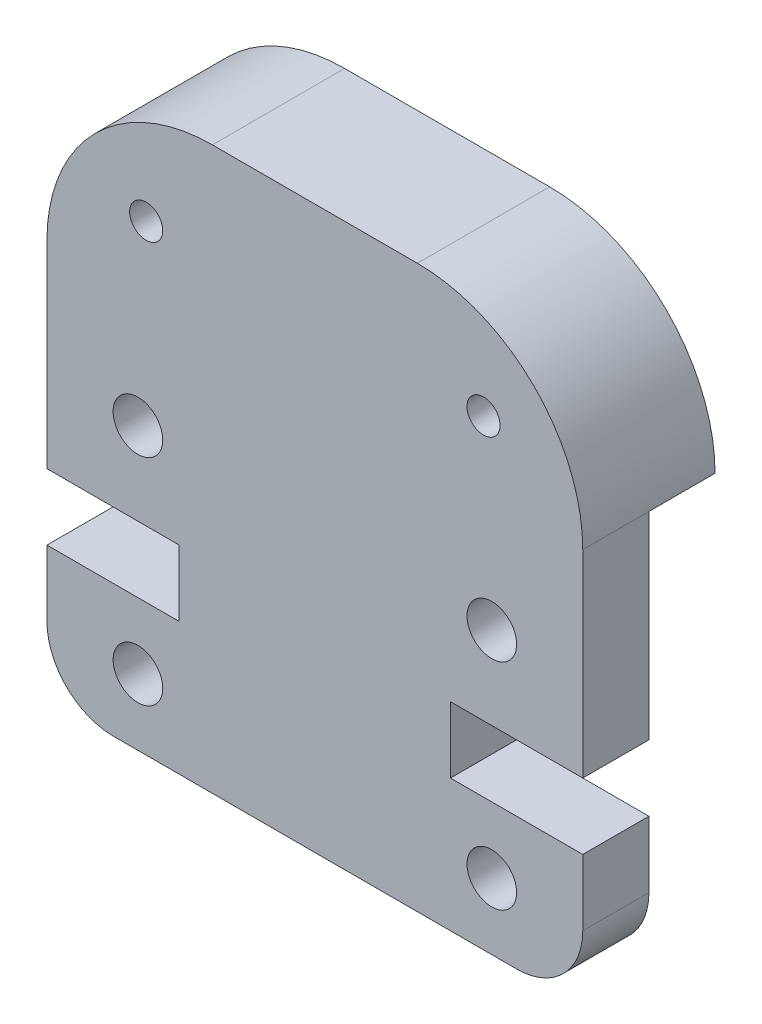
ISO-10303-21;
HEADER;
FILE_DESCRIPTION(('STEP AP214'),'2;1');
FILE_NAME('part.step','',(''),(''),'','','');
FILE_SCHEMA(('AUTOMOTIVE_DESIGN { 1 0 10303 214 1 1 1 1 }'));
ENDSEC;
DATA;
#1=APPLICATION_CONTEXT('core data for automotive mechanical design processes');
#2=APPLICATION_PROTOCOL_DEFINITION('international standard','automotive_design',2000,#1);
#3=PRODUCT_CONTEXT('',#1,'mechanical');
#4=PRODUCT('Part','Part','',(#3));
#5=PRODUCT_RELATED_PRODUCT_CATEGORY('part','',(#4));
#6=PRODUCT_DEFINITION_FORMATION('','',#4);
#7=PRODUCT_DEFINITION_CONTEXT('part definition',#1,'design');
#8=PRODUCT_DEFINITION('design','',#6,#7);
#9=PRODUCT_DEFINITION_SHAPE('','',#8);
#10=(LENGTH_UNIT() NAMED_UNIT(*) SI_UNIT(.MILLI.,.METRE.));
#11=(NAMED_UNIT(*) PLANE_ANGLE_UNIT() SI_UNIT($,.RADIAN.));
#12=(NAMED_UNIT(*) SI_UNIT($,.STERADIAN.) SOLID_ANGLE_UNIT());
#13=UNCERTAINTY_MEASURE_WITH_UNIT(LENGTH_MEASURE(1.E-05),#10,'distance_accuracy_value','');
#14=(GEOMETRIC_REPRESENTATION_CONTEXT(3) GLOBAL_UNCERTAINTY_ASSIGNED_CONTEXT((#13)) GLOBAL_UNIT_ASSIGNED_CONTEXT((#10,
#11,#12)) REPRESENTATION_CONTEXT('',''));
#15=CARTESIAN_POINT('',(0.,0.,0.));
#16=DIRECTION('',(0.,0.,1.));
#17=DIRECTION('',(1.,0.,0.));
#18=AXIS2_PLACEMENT_3D('',#15,#16,#17);
#19=CARTESIAN_POINT('',(-3.09999999999862,11.9799999999986,0.));
#20=DIRECTION('',(0.,0.,-1.));
#21=DIRECTION('',(-1.,0.,0.));
#22=AXIS2_PLACEMENT_3D('',#19,#20,#21);
#23=PLANE('',#22);
#24=CARTESIAN_POINT('',(-5.09999999999842,13.9799999999999,0.));
#25=DIRECTION('',(0.,0.,1.));
#26=DIRECTION('',(-1.,0.,0.));
#27=AXIS2_PLACEMENT_3D('',#24,#25,#26);
#28=CIRCLE('',#27,0.500000000000162);
#29=CARTESIAN_POINT('',(-5.59999999999859,13.9799999999999,0.));
#30=VERTEX_POINT('',#29);
#31=EDGE_CURVE('E277',#30,#30,#28,.T.);
#32=ORIENTED_EDGE('',*,*,#31,.T.);
#33=EDGE_LOOP('',(#32));
#34=FACE_BOUND('',#33,.T.);
#35=CARTESIAN_POINT('',(5.09999999999843,13.9799999999999,0.));
#36=DIRECTION('',(0.,0.,1.));
#37=DIRECTION('',(1.,0.,0.));
#38=AXIS2_PLACEMENT_3D('',#35,#36,#37);
#39=CIRCLE('',#38,0.500000000000168);
#40=CARTESIAN_POINT('',(5.59999999999859,13.9799999999999,0.));
#41=VERTEX_POINT('',#40);
#42=EDGE_CURVE('E265',#41,#41,#39,.T.);
#43=ORIENTED_EDGE('',*,*,#42,.T.);
#44=EDGE_LOOP('',(#43));
#45=FACE_BOUND('',#44,.T.);
#46=CARTESIAN_POINT('',(3.09999999999862,11.9799999999986,0.));
#47=DIRECTION('',(0.,0.,1.));
#48=DIRECTION('',(1.,0.,0.));
#49=AXIS2_PLACEMENT_3D('',#46,#47,#48);
#50=CIRCLE('',#49,5.00000000000135);
#51=CARTESIAN_POINT('',(8.09999999999997,11.9799999999986,0.));
#52=VERTEX_POINT('',#51);
#53=CARTESIAN_POINT('',(3.09999999999862,16.98,0.));
#54=VERTEX_POINT('',#53);
#55=EDGE_CURVE('E69',#52,#54,#50,.T.);
#56=ORIENTED_EDGE('',*,*,#55,.F.);
#57=DIRECTION('',(-1.,0.,0.));
#58=VECTOR('',#57,1.);
#59=CARTESIAN_POINT('',(8.09999999999997,11.9799999999986,0.));
#60=LINE('',#59,#58);
#61=CARTESIAN_POINT('',(-8.09999999999997,11.9799999999986,0.));
#62=VERTEX_POINT('',#61);
#63=EDGE_CURVE('E217',#52,#62,#60,.T.);
#64=ORIENTED_EDGE('',*,*,#63,.T.);
#65=CARTESIAN_POINT('',(-3.09999999999862,11.9799999999986,0.));
#66=DIRECTION('',(0.,0.,1.));
#67=DIRECTION('',(-1.,0.,0.));
#68=AXIS2_PLACEMENT_3D('',#65,#66,#67);
#69=CIRCLE('',#68,5.00000000000136);
#70=CARTESIAN_POINT('',(-3.09999999999862,16.98,0.));
#71=VERTEX_POINT('',#70);
#72=EDGE_CURVE('E150',#71,#62,#69,.T.);
#73=ORIENTED_EDGE('',*,*,#72,.F.);
#74=DIRECTION('',(-1.,0.,0.));
#75=VECTOR('',#74,1.);
#76=CARTESIAN_POINT('',(3.09999999999862,16.98,0.));
#77=LINE('',#76,#75);
#78=EDGE_CURVE('E75',#54,#71,#77,.T.);
#79=ORIENTED_EDGE('',*,*,#78,.F.);
#80=EDGE_LOOP('',(#56,#64,#73,#79));
#81=FACE_BOUND('',#80,.T.);
#82=ADVANCED_FACE('F36',(#34,#45,#81),#23,.T.);
#83=CARTESIAN_POINT('',(-3.09999999999862,11.9799999999986,4.));
#84=DIRECTION('',(0.,0.,-1.));
#85=DIRECTION('',(-1.,0.,0.));
#86=AXIS2_PLACEMENT_3D('',#83,#84,#85);
#87=PLANE('',#86);
#88=CARTESIAN_POINT('',(5.09999999999843,13.9799999999999,4.));
#89=DIRECTION('',(0.,0.,1.));
#90=DIRECTION('',(1.,0.,0.));
#91=AXIS2_PLACEMENT_3D('',#88,#89,#90);
#92=CIRCLE('',#91,0.500000000000168);
#93=CARTESIAN_POINT('',(5.59999999999859,13.9799999999999,4.));
#94=VERTEX_POINT('',#93);
#95=EDGE_CURVE('E266',#94,#94,#92,.T.);
#96=ORIENTED_EDGE('',*,*,#95,.F.);
#97=EDGE_LOOP('',(#96));
#98=FACE_BOUND('',#97,.T.);
#99=CARTESIAN_POINT('',(-5.34999999999997,8.50000000000221,4.));
#100=DIRECTION('',(0.,0.,1.));
#101=DIRECTION('',(-1.,0.,0.));
#102=AXIS2_PLACEMENT_3D('',#99,#100,#101);
#103=CIRCLE('',#102,0.750000000000001);
#104=CARTESIAN_POINT('',(-6.09999999999998,8.50000000000221,4.));
#105=VERTEX_POINT('',#104);
#106=EDGE_CURVE('E274',#105,#105,#103,.T.);
#107=ORIENTED_EDGE('',*,*,#106,.F.);
#108=EDGE_LOOP('',(#107));
#109=FACE_BOUND('',#108,.T.);
#110=CARTESIAN_POINT('',(-5.34999999999999,1.99999999999997,4.));
#111=DIRECTION('',(0.,0.,1.));
#112=DIRECTION('',(-1.,0.,0.));
#113=AXIS2_PLACEMENT_3D('',#110,#111,#112);
#114=CIRCLE('',#113,0.750000000000001);
#115=CARTESIAN_POINT('',(-6.1,1.99999999999997,4.));
#116=VERTEX_POINT('',#115);
#117=EDGE_CURVE('E153',#116,#116,#114,.T.);
#118=ORIENTED_EDGE('',*,*,#117,.F.);
#119=EDGE_LOOP('',(#118));
#120=FACE_BOUND('',#119,.T.);
#121=CARTESIAN_POINT('',(-3.09999999999862,11.9799999999986,4.));
#122=DIRECTION('',(0.,0.,1.));
#123=DIRECTION('',(-1.,0.,0.));
#124=AXIS2_PLACEMENT_3D('',#121,#122,#123);
#125=CIRCLE('',#124,5.00000000000136);
#126=CARTESIAN_POINT('',(-3.09999999999862,16.98,4.));
#127=VERTEX_POINT('',#126);
#128=CARTESIAN_POINT('',(-8.09999999999997,11.9799999999986,4.));
#129=VERTEX_POINT('',#128);
#130=EDGE_CURVE('E156',#127,#129,#125,.T.);
#131=ORIENTED_EDGE('',*,*,#130,.T.);
#132=DIRECTION('',(0.,-1.,0.));
#133=VECTOR('',#132,1.);
#134=CARTESIAN_POINT('',(-8.09999999999997,11.9799999999986,4.));
#135=LINE('',#134,#133);
#136=CARTESIAN_POINT('',(-8.09999999999997,5.99999999999993,4.));
#137=VERTEX_POINT('',#136);
#138=EDGE_CURVE('E83',#129,#137,#135,.T.);
#139=ORIENTED_EDGE('',*,*,#138,.T.);
#140=DIRECTION('',(1.,0.,0.));
#141=VECTOR('',#140,1.);
#142=CARTESIAN_POINT('',(-8.09999999999997,5.99999999999993,4.));
#143=LINE('',#142,#141);
#144=CARTESIAN_POINT('',(-4.10000000000002,5.99999999999993,4.));
#145=VERTEX_POINT('',#144);
#146=EDGE_CURVE('E199',#137,#145,#143,.T.);
#147=ORIENTED_EDGE('',*,*,#146,.T.);
#148=DIRECTION('',(0.,-1.,0.));
#149=VECTOR('',#148,1.);
#150=CARTESIAN_POINT('',(-4.10000000000002,5.99999999999993,4.));
#151=LINE('',#150,#149);
#152=CARTESIAN_POINT('',(-4.10000000000002,3.99999999999995,4.));
#153=VERTEX_POINT('',#152);
#154=EDGE_CURVE('E288',#145,#153,#151,.T.);
#155=ORIENTED_EDGE('',*,*,#154,.T.);
#156=DIRECTION('',(-1.,0.,0.));
#157=VECTOR('',#156,1.);
#158=CARTESIAN_POINT('',(-4.10000000000002,3.99999999999995,4.));
#159=LINE('',#158,#157);
#160=CARTESIAN_POINT('',(-8.09999999999997,3.99999999999995,4.));
#161=VERTEX_POINT('',#160);
#162=EDGE_CURVE('E290',#153,#161,#159,.T.);
#163=ORIENTED_EDGE('',*,*,#162,.T.);
#164=DIRECTION('',(0.,-1.,0.));
#165=VECTOR('',#164,1.);
#166=CARTESIAN_POINT('',(-8.09999999999997,1.99999999999997,4.));
#167=LINE('',#166,#165);
#168=CARTESIAN_POINT('',(-8.09999999999997,1.99999999999997,4.));
#169=VERTEX_POINT('',#168);
#170=EDGE_CURVE('E292',#161,#169,#167,.T.);
#171=ORIENTED_EDGE('',*,*,#170,.T.);
#172=CARTESIAN_POINT('',(-6.1,1.99999999999997,4.));
#173=DIRECTION('',(0.,0.,1.));
#174=DIRECTION('',(-1.,0.,0.));
#175=AXIS2_PLACEMENT_3D('',#172,#173,#174);
#176=CIRCLE('',#175,1.99999999999998);
#177=CARTESIAN_POINT('',(-6.09999999999999,0.,4.));
#178=VERTEX_POINT('',#177);
#179=EDGE_CURVE('E294',#169,#178,#176,.T.);
#180=ORIENTED_EDGE('',*,*,#179,.T.);
#181=DIRECTION('',(1.,0.,0.));
#182=VECTOR('',#181,1.);
#183=CARTESIAN_POINT('',(6.1,0.,4.));
#184=LINE('',#183,#182);
#185=CARTESIAN_POINT('',(6.1,0.,4.));
#186=VERTEX_POINT('',#185);
#187=EDGE_CURVE('E296',#178,#186,#184,.T.);
#188=ORIENTED_EDGE('',*,*,#187,.T.);
#189=CARTESIAN_POINT('',(6.1,1.99999999999998,4.));
#190=DIRECTION('',(0.,0.,1.));
#191=DIRECTION('',(1.,0.,0.));
#192=AXIS2_PLACEMENT_3D('',#189,#190,#191);
#193=CIRCLE('',#192,1.99999999999998);
#194=CARTESIAN_POINT('',(8.09999999999997,1.99999999999998,4.));
#195=VERTEX_POINT('',#194);
#196=EDGE_CURVE('E298',#186,#195,#193,.T.);
#197=ORIENTED_EDGE('',*,*,#196,.T.);
#198=DIRECTION('',(0.,1.,0.));
#199=VECTOR('',#198,1.);
#200=CARTESIAN_POINT('',(8.09999999999997,1.99999999999998,4.));
#201=LINE('',#200,#199);
#202=CARTESIAN_POINT('',(8.09999999999997,3.99999999999995,4.));
#203=VERTEX_POINT('',#202);
#204=EDGE_CURVE('E300',#195,#203,#201,.T.);
#205=ORIENTED_EDGE('',*,*,#204,.T.);
#206=DIRECTION('',(-1.,0.,0.));
#207=VECTOR('',#206,1.);
#208=CARTESIAN_POINT('',(4.10000000000002,3.99999999999995,4.));
#209=LINE('',#208,#207);
#210=CARTESIAN_POINT('',(4.10000000000002,3.99999999999995,4.));
#211=VERTEX_POINT('',#210);
#212=EDGE_CURVE('E302',#203,#211,#209,.T.);
#213=ORIENTED_EDGE('',*,*,#212,.T.);
#214=DIRECTION('',(0.,1.,0.));
#215=VECTOR('',#214,1.);
#216=CARTESIAN_POINT('',(4.10000000000002,5.99999999999993,4.));
#217=LINE('',#216,#215);
#218=CARTESIAN_POINT('',(4.10000000000002,5.99999999999993,4.));
#219=VERTEX_POINT('',#218);
#220=EDGE_CURVE('E304',#211,#219,#217,.T.);
#221=ORIENTED_EDGE('',*,*,#220,.T.);
#222=DIRECTION('',(1.,0.,0.));
#223=VECTOR('',#222,1.);
#224=CARTESIAN_POINT('',(8.09999999999997,5.99999999999993,4.));
#225=LINE('',#224,#223);
#226=CARTESIAN_POINT('',(8.09999999999997,5.99999999999993,4.));
#227=VERTEX_POINT('',#226);
#228=EDGE_CURVE('E129',#219,#227,#225,.T.);
#229=ORIENTED_EDGE('',*,*,#228,.T.);
#230=DIRECTION('',(0.,1.,0.));
#231=VECTOR('',#230,1.);
#232=CARTESIAN_POINT('',(8.09999999999997,11.9799999999986,4.));
#233=LINE('',#232,#231);
#234=CARTESIAN_POINT('',(8.09999999999997,11.9799999999986,4.));
#235=VERTEX_POINT('',#234);
#236=EDGE_CURVE('E122',#227,#235,#233,.T.);
#237=ORIENTED_EDGE('',*,*,#236,.T.);
#238=CARTESIAN_POINT('',(3.09999999999862,11.9799999999986,4.));
#239=DIRECTION('',(0.,0.,1.));
#240=DIRECTION('',(1.,0.,0.));
#241=AXIS2_PLACEMENT_3D('',#238,#239,#240);
#242=CIRCLE('',#241,5.00000000000135);
#243=CARTESIAN_POINT('',(3.09999999999862,16.98,4.));
#244=VERTEX_POINT('',#243);
#245=EDGE_CURVE('E127',#235,#244,#242,.T.);
#246=ORIENTED_EDGE('',*,*,#245,.T.);
#247=DIRECTION('',(-1.,0.,0.));
#248=VECTOR('',#247,1.);
#249=CARTESIAN_POINT('',(3.09999999999862,16.98,4.));
#250=LINE('',#249,#248);
#251=EDGE_CURVE('E54',#244,#127,#250,.T.);
#252=ORIENTED_EDGE('',*,*,#251,.T.);
#253=EDGE_LOOP('',(#131,#139,#147,#155,#163,#171,#180,#188,#197,#205,#213,#221,#229,#237,#246,#252));
#254=FACE_BOUND('',#253,.T.);
#255=CARTESIAN_POINT('',(-5.09999999999842,13.9799999999999,4.));
#256=DIRECTION('',(0.,0.,1.));
#257=DIRECTION('',(-1.,0.,0.));
#258=AXIS2_PLACEMENT_3D('',#255,#256,#257);
#259=CIRCLE('',#258,0.500000000000162);
#260=CARTESIAN_POINT('',(-5.59999999999859,13.9799999999999,4.));
#261=VERTEX_POINT('',#260);
#262=EDGE_CURVE('E278',#261,#261,#259,.T.);
#263=ORIENTED_EDGE('',*,*,#262,.F.);
#264=EDGE_LOOP('',(#263));
#265=FACE_BOUND('',#264,.T.);
#266=CARTESIAN_POINT('',(5.34999999999998,8.50000000000221,4.));
#267=DIRECTION('',(0.,0.,1.));
#268=DIRECTION('',(1.,0.,0.));
#269=AXIS2_PLACEMENT_3D('',#266,#267,#268);
#270=CIRCLE('',#269,0.750000000000001);
#271=CARTESIAN_POINT('',(6.09999999999998,8.50000000000221,4.));
#272=VERTEX_POINT('',#271);
#273=EDGE_CURVE('E269',#272,#272,#270,.T.);
#274=ORIENTED_EDGE('',*,*,#273,.F.);
#275=EDGE_LOOP('',(#274));
#276=FACE_BOUND('',#275,.T.);
#277=CARTESIAN_POINT('',(5.35,1.99999999999998,4.));
#278=DIRECTION('',(0.,0.,1.));
#279=DIRECTION('',(1.,0.,0.));
#280=AXIS2_PLACEMENT_3D('',#277,#278,#279);
#281=CIRCLE('',#280,0.750000000000001);
#282=CARTESIAN_POINT('',(6.1,1.99999999999998,4.));
#283=VERTEX_POINT('',#282);
#284=EDGE_CURVE('E262',#283,#283,#281,.T.);
#285=ORIENTED_EDGE('',*,*,#284,.F.);
#286=EDGE_LOOP('',(#285));
#287=FACE_BOUND('',#286,.T.);
#288=ADVANCED_FACE('F124',(#98,#109,#120,#254,#265,#276,#287),#87,.F.);
#289=CARTESIAN_POINT('',(-3.09999999999862,11.9799999999986,4.));
#290=DIRECTION('',(0.,0.,-1.));
#291=DIRECTION('',(-1.,0.,0.));
#292=AXIS2_PLACEMENT_3D('',#289,#290,#291);
#293=CYLINDRICAL_SURFACE('',#292,5.00000000000136);
#294=ORIENTED_EDGE('',*,*,#72,.T.);
#295=DIRECTION('',(0.,0.,-1.));
#296=VECTOR('',#295,1.);
#297=CARTESIAN_POINT('',(-8.09999999999997,11.9799999999986,2.));
#298=LINE('',#297,#296);
#299=CARTESIAN_POINT('',(-8.09999999999997,11.9799999999986,2.));
#300=VERTEX_POINT('',#299);
#301=EDGE_CURVE('E224',#300,#62,#298,.T.);
#302=ORIENTED_EDGE('',*,*,#301,.F.);
#303=DIRECTION('',(0.,0.,-1.));
#304=VECTOR('',#303,1.);
#305=CARTESIAN_POINT('',(-8.09999999999997,11.9799999999986,4.));
#306=LINE('',#305,#304);
#307=EDGE_CURVE('E11',#129,#300,#306,.T.);
#308=ORIENTED_EDGE('',*,*,#307,.F.);
#309=ORIENTED_EDGE('',*,*,#130,.F.);
#310=DIRECTION('',(0.,0.,-1.));
#311=VECTOR('',#310,1.);
#312=CARTESIAN_POINT('',(-3.09999999999862,16.98,4.));
#313=LINE('',#312,#311);
#314=EDGE_CURVE('E146',#127,#71,#313,.T.);
#315=ORIENTED_EDGE('',*,*,#314,.T.);
#316=EDGE_LOOP('',(#294,#302,#308,#309,#315));
#317=FACE_BOUND('',#316,.T.);
#318=ADVANCED_FACE('F38',(#317),#293,.T.);
#319=CARTESIAN_POINT('',(-8.09999999999997,11.9799999999986,4.));
#320=DIRECTION('',(1.,0.,0.));
#321=DIRECTION('',(0.,1.,0.));
#322=AXIS2_PLACEMENT_3D('',#319,#320,#321);
#323=PLANE('',#322);
#324=ORIENTED_EDGE('',*,*,#307,.T.);
#325=DIRECTION('',(0.,-1.,0.));
#326=VECTOR('',#325,1.);
#327=CARTESIAN_POINT('',(-8.09999999999997,11.9799999999986,2.));
#328=LINE('',#327,#326);
#329=CARTESIAN_POINT('',(-8.09999999999997,5.99999999999993,2.));
#330=VERTEX_POINT('',#329);
#331=EDGE_CURVE('E206',#300,#330,#328,.T.);
#332=ORIENTED_EDGE('',*,*,#331,.T.);
#333=DIRECTION('',(0.,0.,-1.));
#334=VECTOR('',#333,1.);
#335=CARTESIAN_POINT('',(-8.09999999999997,5.99999999999993,4.));
#336=LINE('',#335,#334);
#337=EDGE_CURVE('E46',#137,#330,#336,.T.);
#338=ORIENTED_EDGE('',*,*,#337,.F.);
#339=ORIENTED_EDGE('',*,*,#138,.F.);
#340=EDGE_LOOP('',(#324,#332,#338,#339));
#341=FACE_BOUND('',#340,.T.);
#342=ADVANCED_FACE('F204',(#341),#323,.F.);
#343=CARTESIAN_POINT('',(-8.09999999999997,5.99999999999993,4.));
#344=DIRECTION('',(0.,1.,0.));
#345=DIRECTION('',(-1.,0.,0.));
#346=AXIS2_PLACEMENT_3D('',#343,#344,#345);
#347=PLANE('',#346);
#348=ORIENTED_EDGE('',*,*,#337,.T.);
#349=DIRECTION('',(1.,0.,0.));
#350=VECTOR('',#349,1.);
#351=CARTESIAN_POINT('',(-8.09999999999997,5.99999999999993,2.));
#352=LINE('',#351,#350);
#353=CARTESIAN_POINT('',(-4.10000000000002,5.99999999999993,2.));
#354=VERTEX_POINT('',#353);
#355=EDGE_CURVE('E198',#330,#354,#352,.T.);
#356=ORIENTED_EDGE('',*,*,#355,.T.);
#357=DIRECTION('',(0.,0.,-1.));
#358=VECTOR('',#357,1.);
#359=CARTESIAN_POINT('',(-4.10000000000002,5.99999999999993,4.));
#360=LINE('',#359,#358);
#361=EDGE_CURVE('E187',#145,#354,#360,.T.);
#362=ORIENTED_EDGE('',*,*,#361,.F.);
#363=ORIENTED_EDGE('',*,*,#146,.F.);
#364=EDGE_LOOP('',(#348,#356,#362,#363));
#365=FACE_BOUND('',#364,.T.);
#366=ADVANCED_FACE('F195',(#365),#347,.F.);
#367=CARTESIAN_POINT('',(-4.10000000000002,5.99999999999993,4.));
#368=DIRECTION('',(1.,0.,0.));
#369=DIRECTION('',(0.,0.,-1.));
#370=AXIS2_PLACEMENT_3D('',#367,#368,#369);
#371=PLANE('',#370);
#372=ORIENTED_EDGE('',*,*,#361,.T.);
#373=DIRECTION('',(0.,-1.,0.));
#374=VECTOR('',#373,1.);
#375=CARTESIAN_POINT('',(-4.10000000000002,5.99999999999993,2.));
#376=LINE('',#375,#374);
#377=CARTESIAN_POINT('',(-4.10000000000002,3.99999999999995,2.));
#378=VERTEX_POINT('',#377);
#379=EDGE_CURVE('E258',#354,#378,#376,.T.);
#380=ORIENTED_EDGE('',*,*,#379,.T.);
#381=DIRECTION('',(0.,0.,-1.));
#382=VECTOR('',#381,1.);
#383=CARTESIAN_POINT('',(-4.10000000000002,3.99999999999995,4.));
#384=LINE('',#383,#382);
#385=EDGE_CURVE('E184',#153,#378,#384,.T.);
#386=ORIENTED_EDGE('',*,*,#385,.F.);
#387=ORIENTED_EDGE('',*,*,#154,.F.);
#388=EDGE_LOOP('',(#372,#380,#386,#387));
#389=FACE_BOUND('',#388,.T.);
#390=ADVANCED_FACE('F333',(#389),#371,.F.);
#391=CARTESIAN_POINT('',(-4.10000000000002,3.99999999999995,4.));
#392=DIRECTION('',(0.,-1.,0.));
#393=DIRECTION('',(1.,0.,0.));
#394=AXIS2_PLACEMENT_3D('',#391,#392,#393);
#395=PLANE('',#394);
#396=ORIENTED_EDGE('',*,*,#385,.T.);
#397=DIRECTION('',(-1.,0.,0.));
#398=VECTOR('',#397,1.);
#399=CARTESIAN_POINT('',(-4.10000000000002,3.99999999999995,2.));
#400=LINE('',#399,#398);
#401=CARTESIAN_POINT('',(-8.09999999999997,3.99999999999995,2.));
#402=VERTEX_POINT('',#401);
#403=EDGE_CURVE('E255',#378,#402,#400,.T.);
#404=ORIENTED_EDGE('',*,*,#403,.T.);
#405=DIRECTION('',(0.,0.,-1.));
#406=VECTOR('',#405,1.);
#407=CARTESIAN_POINT('',(-8.09999999999997,3.99999999999995,4.));
#408=LINE('',#407,#406);
#409=EDGE_CURVE('E181',#161,#402,#408,.T.);
#410=ORIENTED_EDGE('',*,*,#409,.F.);
#411=ORIENTED_EDGE('',*,*,#162,.F.);
#412=EDGE_LOOP('',(#396,#404,#410,#411));
#413=FACE_BOUND('',#412,.T.);
#414=ADVANCED_FACE('F337',(#413),#395,.F.);
#415=CARTESIAN_POINT('',(-8.09999999999997,1.99999999999997,4.));
#416=DIRECTION('',(1.,0.,0.));
#417=DIRECTION('',(0.,0.,-1.));
#418=AXIS2_PLACEMENT_3D('',#415,#416,#417);
#419=PLANE('',#418);
#420=ORIENTED_EDGE('',*,*,#409,.T.);
#421=CARTESIAN_POINT('',(-8.09999999999997,1.99999999999997,2.));
#422=VERTEX_POINT('',#421);
#423=EDGE_CURVE('E212',#402,#422,#328,.T.);
#424=ORIENTED_EDGE('',*,*,#423,.T.);
#425=DIRECTION('',(0.,0.,-1.));
#426=VECTOR('',#425,1.);
#427=CARTESIAN_POINT('',(-8.09999999999997,1.99999999999997,4.));
#428=LINE('',#427,#426);
#429=EDGE_CURVE('E178',#169,#422,#428,.T.);
#430=ORIENTED_EDGE('',*,*,#429,.F.);
#431=ORIENTED_EDGE('',*,*,#170,.F.);
#432=EDGE_LOOP('',(#420,#424,#430,#431));
#433=FACE_BOUND('',#432,.T.);
#434=ADVANCED_FACE('F393',(#433),#419,.F.);
#435=CARTESIAN_POINT('',(-6.1,1.99999999999997,4.));
#436=DIRECTION('',(0.,0.,-1.));
#437=DIRECTION('',(-1.,0.,0.));
#438=AXIS2_PLACEMENT_3D('',#435,#436,#437);
#439=CYLINDRICAL_SURFACE('',#438,1.99999999999998);
#440=ORIENTED_EDGE('',*,*,#429,.T.);
#441=CARTESIAN_POINT('',(-6.1,1.99999999999997,2.));
#442=DIRECTION('',(0.,0.,1.));
#443=DIRECTION('',(1.,0.,0.));
#444=AXIS2_PLACEMENT_3D('',#441,#442,#443);
#445=CIRCLE('',#444,1.99999999999998);
#446=CARTESIAN_POINT('',(-6.09999999999999,0.,2.));
#447=VERTEX_POINT('',#446);
#448=EDGE_CURVE('E252',#422,#447,#445,.T.);
#449=ORIENTED_EDGE('',*,*,#448,.T.);
#450=DIRECTION('',(0.,0.,-1.));
#451=VECTOR('',#450,1.);
#452=CARTESIAN_POINT('',(-6.09999999999999,0.,4.));
#453=LINE('',#452,#451);
#454=EDGE_CURVE('E175',#178,#447,#453,.T.);
#455=ORIENTED_EDGE('',*,*,#454,.F.);
#456=ORIENTED_EDGE('',*,*,#179,.F.);
#457=EDGE_LOOP('',(#440,#449,#455,#456));
#458=FACE_BOUND('',#457,.T.);
#459=ADVANCED_FACE('F389',(#458),#439,.T.);
#460=CARTESIAN_POINT('',(6.1,0.,4.));
#461=DIRECTION('',(0.,1.,0.));
#462=DIRECTION('',(-1.,0.,0.));
#463=AXIS2_PLACEMENT_3D('',#460,#461,#462);
#464=PLANE('',#463);
#465=ORIENTED_EDGE('',*,*,#454,.T.);
#466=DIRECTION('',(1.,0.,0.));
#467=VECTOR('',#466,1.);
#468=CARTESIAN_POINT('',(-8.09999999999997,0.,2.));
#469=LINE('',#468,#467);
#470=CARTESIAN_POINT('',(6.1,0.,2.));
#471=VERTEX_POINT('',#470);
#472=EDGE_CURVE('E211',#447,#471,#469,.T.);
#473=ORIENTED_EDGE('',*,*,#472,.T.);
#474=DIRECTION('',(0.,0.,-1.));
#475=VECTOR('',#474,1.);
#476=CARTESIAN_POINT('',(6.1,0.,4.));
#477=LINE('',#476,#475);
#478=EDGE_CURVE('E172',#186,#471,#477,.T.);
#479=ORIENTED_EDGE('',*,*,#478,.F.);
#480=ORIENTED_EDGE('',*,*,#187,.F.);
#481=EDGE_LOOP('',(#465,#473,#479,#480));
#482=FACE_BOUND('',#481,.T.);
#483=ADVANCED_FACE('F385',(#482),#464,.F.);
#484=CARTESIAN_POINT('',(6.1,1.99999999999998,4.));
#485=DIRECTION('',(0.,0.,-1.));
#486=DIRECTION('',(-1.,0.,0.));
#487=AXIS2_PLACEMENT_3D('',#484,#485,#486);
#488=CYLINDRICAL_SURFACE('',#487,1.99999999999998);
#489=ORIENTED_EDGE('',*,*,#478,.T.);
#490=CARTESIAN_POINT('',(6.1,1.99999999999998,2.));
#491=DIRECTION('',(0.,0.,1.));
#492=DIRECTION('',(1.,0.,0.));
#493=AXIS2_PLACEMENT_3D('',#490,#491,#492);
#494=CIRCLE('',#493,1.99999999999998);
#495=CARTESIAN_POINT('',(8.09999999999997,1.99999999999998,2.));
#496=VERTEX_POINT('',#495);
#497=EDGE_CURVE('E249',#471,#496,#494,.T.);
#498=ORIENTED_EDGE('',*,*,#497,.T.);
#499=DIRECTION('',(0.,0.,-1.));
#500=VECTOR('',#499,1.);
#501=CARTESIAN_POINT('',(8.09999999999997,1.99999999999998,4.));
#502=LINE('',#501,#500);
#503=EDGE_CURVE('E169',#195,#496,#502,.T.);
#504=ORIENTED_EDGE('',*,*,#503,.F.);
#505=ORIENTED_EDGE('',*,*,#196,.F.);
#506=EDGE_LOOP('',(#489,#498,#504,#505));
#507=FACE_BOUND('',#506,.T.);
#508=ADVANCED_FACE('F381',(#507),#488,.T.);
#509=CARTESIAN_POINT('',(8.09999999999997,1.99999999999998,4.));
#510=DIRECTION('',(-1.,0.,0.));
#511=DIRECTION('',(0.,0.,1.));
#512=AXIS2_PLACEMENT_3D('',#509,#510,#511);
#513=PLANE('',#512);
#514=ORIENTED_EDGE('',*,*,#503,.T.);
#515=DIRECTION('',(0.,1.,0.));
#516=VECTOR('',#515,1.);
#517=CARTESIAN_POINT('',(8.09999999999997,0.,2.));
#518=LINE('',#517,#516);
#519=CARTESIAN_POINT('',(8.09999999999997,3.99999999999995,2.));
#520=VERTEX_POINT('',#519);
#521=EDGE_CURVE('E220',#496,#520,#518,.T.);
#522=ORIENTED_EDGE('',*,*,#521,.T.);
#523=DIRECTION('',(0.,0.,-1.));
#524=VECTOR('',#523,1.);
#525=CARTESIAN_POINT('',(8.09999999999997,3.99999999999995,4.));
#526=LINE('',#525,#524);
#527=EDGE_CURVE('E166',#203,#520,#526,.T.);
#528=ORIENTED_EDGE('',*,*,#527,.F.);
#529=ORIENTED_EDGE('',*,*,#204,.F.);
#530=EDGE_LOOP('',(#514,#522,#528,#529));
#531=FACE_BOUND('',#530,.T.);
#532=ADVANCED_FACE('F377',(#531),#513,.F.);
#533=CARTESIAN_POINT('',(4.10000000000002,3.99999999999995,4.));
#534=DIRECTION('',(0.,-1.,0.));
#535=DIRECTION('',(0.,0.,-1.));
#536=AXIS2_PLACEMENT_3D('',#533,#534,#535);
#537=PLANE('',#536);
#538=ORIENTED_EDGE('',*,*,#527,.T.);
#539=DIRECTION('',(-1.,0.,0.));
#540=VECTOR('',#539,1.);
#541=CARTESIAN_POINT('',(4.10000000000002,3.99999999999995,2.));
#542=LINE('',#541,#540);
#543=CARTESIAN_POINT('',(4.10000000000002,3.99999999999995,2.));
#544=VERTEX_POINT('',#543);
#545=EDGE_CURVE('E246',#520,#544,#542,.T.);
#546=ORIENTED_EDGE('',*,*,#545,.T.);
#547=DIRECTION('',(0.,0.,-1.));
#548=VECTOR('',#547,1.);
#549=CARTESIAN_POINT('',(4.10000000000002,3.99999999999995,4.));
#550=LINE('',#549,#548);
#551=EDGE_CURVE('E163',#211,#544,#550,.T.);
#552=ORIENTED_EDGE('',*,*,#551,.F.);
#553=ORIENTED_EDGE('',*,*,#212,.F.);
#554=EDGE_LOOP('',(#538,#546,#552,#553));
#555=FACE_BOUND('',#554,.T.);
#556=ADVANCED_FACE('F374',(#555),#537,.F.);
#557=CARTESIAN_POINT('',(4.10000000000002,5.99999999999993,4.));
#558=DIRECTION('',(-1.,0.,0.));
#559=DIRECTION('',(0.,0.,1.));
#560=AXIS2_PLACEMENT_3D('',#557,#558,#559);
#561=PLANE('',#560);
#562=ORIENTED_EDGE('',*,*,#551,.T.);
#563=DIRECTION('',(0.,1.,0.));
#564=VECTOR('',#563,1.);
#565=CARTESIAN_POINT('',(4.10000000000002,5.99999999999993,2.));
#566=LINE('',#565,#564);
#567=CARTESIAN_POINT('',(4.10000000000002,5.99999999999993,2.));
#568=VERTEX_POINT('',#567);
#569=EDGE_CURVE('E243',#544,#568,#566,.T.);
#570=ORIENTED_EDGE('',*,*,#569,.T.);
#571=DIRECTION('',(0.,0.,-1.));
#572=VECTOR('',#571,1.);
#573=CARTESIAN_POINT('',(4.10000000000002,5.99999999999993,4.));
#574=LINE('',#573,#572);
#575=EDGE_CURVE('E160',#219,#568,#574,.T.);
#576=ORIENTED_EDGE('',*,*,#575,.F.);
#577=ORIENTED_EDGE('',*,*,#220,.F.);
#578=EDGE_LOOP('',(#562,#570,#576,#577));
#579=FACE_BOUND('',#578,.T.);
#580=ADVANCED_FACE('F310',(#579),#561,.F.);
#581=CARTESIAN_POINT('',(8.09999999999997,5.99999999999993,4.));
#582=DIRECTION('',(0.,1.,0.));
#583=DIRECTION('',(0.,0.,1.));
#584=AXIS2_PLACEMENT_3D('',#581,#582,#583);
#585=PLANE('',#584);
#586=ORIENTED_EDGE('',*,*,#575,.T.);
#587=DIRECTION('',(1.,0.,0.));
#588=VECTOR('',#587,1.);
#589=CARTESIAN_POINT('',(8.09999999999997,5.99999999999993,2.));
#590=LINE('',#589,#588);
#591=CARTESIAN_POINT('',(8.09999999999997,5.99999999999993,2.));
#592=VERTEX_POINT('',#591);
#593=EDGE_CURVE('E240',#568,#592,#590,.T.);
#594=ORIENTED_EDGE('',*,*,#593,.T.);
#595=DIRECTION('',(0.,0.,-1.));
#596=VECTOR('',#595,1.);
#597=CARTESIAN_POINT('',(8.09999999999997,5.99999999999993,4.));
#598=LINE('',#597,#596);
#599=EDGE_CURVE('E141',#227,#592,#598,.T.);
#600=ORIENTED_EDGE('',*,*,#599,.F.);
#601=ORIENTED_EDGE('',*,*,#228,.F.);
#602=EDGE_LOOP('',(#586,#594,#600,#601));
#603=FACE_BOUND('',#602,.T.);
#604=ADVANCED_FACE('F314',(#603),#585,.F.);
#605=CARTESIAN_POINT('',(8.09999999999997,11.9799999999986,4.));
#606=DIRECTION('',(-1.,0.,0.));
#607=DIRECTION('',(0.,0.,1.));
#608=AXIS2_PLACEMENT_3D('',#605,#606,#607);
#609=PLANE('',#608);
#610=ORIENTED_EDGE('',*,*,#599,.T.);
#611=CARTESIAN_POINT('',(8.09999999999997,11.9799999999986,2.));
#612=VERTEX_POINT('',#611);
#613=EDGE_CURVE('E140',#592,#612,#518,.T.);
#614=ORIENTED_EDGE('',*,*,#613,.T.);
#615=DIRECTION('',(0.,0.,-1.));
#616=VECTOR('',#615,1.);
#617=CARTESIAN_POINT('',(8.09999999999997,11.9799999999986,4.));
#618=LINE('',#617,#616);
#619=EDGE_CURVE('E136',#235,#612,#618,.T.);
#620=ORIENTED_EDGE('',*,*,#619,.F.);
#621=ORIENTED_EDGE('',*,*,#236,.F.);
#622=EDGE_LOOP('',(#610,#614,#620,#621));
#623=FACE_BOUND('',#622,.T.);
#624=ADVANCED_FACE('F137',(#623),#609,.F.);
#625=CARTESIAN_POINT('',(3.09999999999862,11.9799999999986,4.));
#626=DIRECTION('',(0.,0.,-1.));
#627=DIRECTION('',(-1.,0.,0.));
#628=AXIS2_PLACEMENT_3D('',#625,#626,#627);
#629=CYLINDRICAL_SURFACE('',#628,5.00000000000135);
#630=ORIENTED_EDGE('',*,*,#55,.T.);
#631=DIRECTION('',(0.,0.,-1.));
#632=VECTOR('',#631,1.);
#633=CARTESIAN_POINT('',(3.09999999999862,16.98,4.));
#634=LINE('',#633,#632);
#635=EDGE_CURVE('E142',#244,#54,#634,.T.);
#636=ORIENTED_EDGE('',*,*,#635,.F.);
#637=ORIENTED_EDGE('',*,*,#245,.F.);
#638=ORIENTED_EDGE('',*,*,#619,.T.);
#639=DIRECTION('',(0.,0.,-1.));
#640=VECTOR('',#639,1.);
#641=CARTESIAN_POINT('',(8.09999999999997,11.9799999999986,2.));
#642=LINE('',#641,#640);
#643=EDGE_CURVE('E229',#612,#52,#642,.T.);
#644=ORIENTED_EDGE('',*,*,#643,.T.);
#645=EDGE_LOOP('',(#630,#636,#637,#638,#644));
#646=FACE_BOUND('',#645,.T.);
#647=ADVANCED_FACE('F144',(#646),#629,.T.);
#648=CARTESIAN_POINT('',(3.09999999999862,16.98,4.));
#649=DIRECTION('',(0.,-1.,0.));
#650=DIRECTION('',(0.,0.,-1.));
#651=AXIS2_PLACEMENT_3D('',#648,#649,#650);
#652=PLANE('',#651);
#653=ORIENTED_EDGE('',*,*,#78,.T.);
#654=ORIENTED_EDGE('',*,*,#314,.F.);
#655=ORIENTED_EDGE('',*,*,#251,.F.);
#656=ORIENTED_EDGE('',*,*,#635,.T.);
#657=EDGE_LOOP('',(#653,#654,#655,#656));
#658=FACE_BOUND('',#657,.T.);
#659=ADVANCED_FACE('F362',(#658),#652,.F.);
#660=CARTESIAN_POINT('',(-5.34999999999999,1.99999999999997,4.));
#661=DIRECTION('',(0.,0.,-1.));
#662=DIRECTION('',(-1.,0.,0.));
#663=AXIS2_PLACEMENT_3D('',#660,#661,#662);
#664=CYLINDRICAL_SURFACE('',#663,0.750000000000001);
#665=CARTESIAN_POINT('',(-5.34999999999999,1.99999999999997,2.));
#666=DIRECTION('',(0.,0.,1.));
#667=DIRECTION('',(1.,0.,0.));
#668=AXIS2_PLACEMENT_3D('',#665,#666,#667);
#669=CIRCLE('',#668,0.750000000000001);
#670=CARTESIAN_POINT('',(-4.59999999999999,1.99999999999997,2.));
#671=VERTEX_POINT('',#670);
#672=EDGE_CURVE('E237',#671,#671,#669,.T.);
#673=ORIENTED_EDGE('',*,*,#672,.F.);
#674=EDGE_LOOP('',(#673));
#675=FACE_BOUND('',#674,.T.);
#676=ORIENTED_EDGE('',*,*,#117,.T.);
#677=EDGE_LOOP('',(#676));
#678=FACE_BOUND('',#677,.T.);
#679=ADVANCED_FACE('F365',(#675,#678),#664,.F.);
#680=CARTESIAN_POINT('',(-5.09999999999842,13.9799999999999,4.));
#681=DIRECTION('',(0.,0.,-1.));
#682=DIRECTION('',(-1.,0.,0.));
#683=AXIS2_PLACEMENT_3D('',#680,#681,#682);
#684=CYLINDRICAL_SURFACE('',#683,0.500000000000162);
#685=ORIENTED_EDGE('',*,*,#262,.T.);
#686=EDGE_LOOP('',(#685));
#687=FACE_BOUND('',#686,.T.);
#688=ORIENTED_EDGE('',*,*,#31,.F.);
#689=EDGE_LOOP('',(#688));
#690=FACE_BOUND('',#689,.T.);
#691=ADVANCED_FACE('F427',(#687,#690),#684,.F.);
#692=CARTESIAN_POINT('',(-5.34999999999997,8.50000000000221,4.));
#693=DIRECTION('',(0.,0.,-1.));
#694=DIRECTION('',(-1.,0.,0.));
#695=AXIS2_PLACEMENT_3D('',#692,#693,#694);
#696=CYLINDRICAL_SURFACE('',#695,0.750000000000001);
#697=CARTESIAN_POINT('',(-5.34999999999997,8.50000000000221,2.));
#698=DIRECTION('',(0.,0.,1.));
#699=DIRECTION('',(1.,0.,0.));
#700=AXIS2_PLACEMENT_3D('',#697,#698,#699);
#701=CIRCLE('',#700,0.750000000000001);
#702=CARTESIAN_POINT('',(-4.59999999999997,8.50000000000221,2.));
#703=VERTEX_POINT('',#702);
#704=EDGE_CURVE('E234',#703,#703,#701,.T.);
#705=ORIENTED_EDGE('',*,*,#704,.F.);
#706=EDGE_LOOP('',(#705));
#707=FACE_BOUND('',#706,.T.);
#708=ORIENTED_EDGE('',*,*,#106,.T.);
#709=EDGE_LOOP('',(#708));
#710=FACE_BOUND('',#709,.T.);
#711=ADVANCED_FACE('F432',(#707,#710),#696,.F.);
#712=CARTESIAN_POINT('',(5.34999999999998,8.50000000000221,4.));
#713=DIRECTION('',(0.,0.,-1.));
#714=DIRECTION('',(-1.,0.,0.));
#715=AXIS2_PLACEMENT_3D('',#712,#713,#714);
#716=CYLINDRICAL_SURFACE('',#715,0.750000000000001);
#717=CARTESIAN_POINT('',(5.34999999999998,8.50000000000221,2.));
#718=DIRECTION('',(0.,0.,1.));
#719=DIRECTION('',(1.,0.,0.));
#720=AXIS2_PLACEMENT_3D('',#717,#718,#719);
#721=CIRCLE('',#720,0.750000000000001);
#722=CARTESIAN_POINT('',(6.09999999999998,8.50000000000221,2.));
#723=VERTEX_POINT('',#722);
#724=EDGE_CURVE('E231',#723,#723,#721,.T.);
#725=ORIENTED_EDGE('',*,*,#724,.F.);
#726=EDGE_LOOP('',(#725));
#727=FACE_BOUND('',#726,.T.);
#728=ORIENTED_EDGE('',*,*,#273,.T.);
#729=EDGE_LOOP('',(#728));
#730=FACE_BOUND('',#729,.T.);
#731=ADVANCED_FACE('F445',(#727,#730),#716,.F.);
#732=CARTESIAN_POINT('',(5.09999999999843,13.9799999999999,4.));
#733=DIRECTION('',(0.,0.,-1.));
#734=DIRECTION('',(-1.,0.,0.));
#735=AXIS2_PLACEMENT_3D('',#732,#733,#734);
#736=CYLINDRICAL_SURFACE('',#735,0.500000000000168);
#737=ORIENTED_EDGE('',*,*,#95,.T.);
#738=EDGE_LOOP('',(#737));
#739=FACE_BOUND('',#738,.T.);
#740=ORIENTED_EDGE('',*,*,#42,.F.);
#741=EDGE_LOOP('',(#740));
#742=FACE_BOUND('',#741,.T.);
#743=ADVANCED_FACE('F440',(#739,#742),#736,.F.);
#744=CARTESIAN_POINT('',(5.35,1.99999999999998,4.));
#745=DIRECTION('',(0.,0.,-1.));
#746=DIRECTION('',(-1.,0.,0.));
#747=AXIS2_PLACEMENT_3D('',#744,#745,#746);
#748=CYLINDRICAL_SURFACE('',#747,0.750000000000001);
#749=CARTESIAN_POINT('',(5.35,1.99999999999998,2.));
#750=DIRECTION('',(0.,0.,1.));
#751=DIRECTION('',(1.,0.,0.));
#752=AXIS2_PLACEMENT_3D('',#749,#750,#751);
#753=CIRCLE('',#752,0.750000000000001);
#754=CARTESIAN_POINT('',(6.1,1.99999999999998,2.));
#755=VERTEX_POINT('',#754);
#756=EDGE_CURVE('E40',#755,#755,#753,.T.);
#757=ORIENTED_EDGE('',*,*,#756,.F.);
#758=EDGE_LOOP('',(#757));
#759=FACE_BOUND('',#758,.T.);
#760=ORIENTED_EDGE('',*,*,#284,.T.);
#761=EDGE_LOOP('',(#760));
#762=FACE_BOUND('',#761,.T.);
#763=ADVANCED_FACE('F444',(#759,#762),#748,.F.);
#764=CARTESIAN_POINT('',(0.,0.,2.));
#765=DIRECTION('',(0.,0.,1.));
#766=DIRECTION('',(1.,0.,0.));
#767=AXIS2_PLACEMENT_3D('',#764,#765,#766);
#768=PLANE('',#767);
#769=ORIENTED_EDGE('',*,*,#672,.T.);
#770=EDGE_LOOP('',(#769));
#771=FACE_BOUND('',#770,.T.);
#772=ORIENTED_EDGE('',*,*,#704,.T.);
#773=EDGE_LOOP('',(#772));
#774=FACE_BOUND('',#773,.T.);
#775=ORIENTED_EDGE('',*,*,#724,.T.);
#776=EDGE_LOOP('',(#775));
#777=FACE_BOUND('',#776,.T.);
#778=ORIENTED_EDGE('',*,*,#756,.T.);
#779=EDGE_LOOP('',(#778));
#780=FACE_BOUND('',#779,.T.);
#781=ORIENTED_EDGE('',*,*,#331,.F.);
#782=DIRECTION('',(-1.,0.,0.));
#783=VECTOR('',#782,1.);
#784=CARTESIAN_POINT('',(8.09999999999997,11.9799999999986,2.));
#785=LINE('',#784,#783);
#786=EDGE_CURVE('E221',#612,#300,#785,.T.);
#787=ORIENTED_EDGE('',*,*,#786,.F.);
#788=ORIENTED_EDGE('',*,*,#613,.F.);
#789=ORIENTED_EDGE('',*,*,#593,.F.);
#790=ORIENTED_EDGE('',*,*,#569,.F.);
#791=ORIENTED_EDGE('',*,*,#545,.F.);
#792=ORIENTED_EDGE('',*,*,#521,.F.);
#793=ORIENTED_EDGE('',*,*,#497,.F.);
#794=ORIENTED_EDGE('',*,*,#472,.F.);
#795=ORIENTED_EDGE('',*,*,#448,.F.);
#796=ORIENTED_EDGE('',*,*,#423,.F.);
#797=ORIENTED_EDGE('',*,*,#403,.F.);
#798=ORIENTED_EDGE('',*,*,#379,.F.);
#799=ORIENTED_EDGE('',*,*,#355,.F.);
#800=EDGE_LOOP('',(#781,#787,#788,#789,#790,#791,#792,#793,#794,#795,#796,#797,#798,#799));
#801=FACE_BOUND('',#800,.T.);
#802=ADVANCED_FACE('F330',(#771,#774,#777,#780,#801),#768,.F.);
#803=CARTESIAN_POINT('',(8.09999999999997,11.9799999999986,2.));
#804=DIRECTION('',(0.,-1.,0.));
#805=DIRECTION('',(1.,0.,0.));
#806=AXIS2_PLACEMENT_3D('',#803,#804,#805);
#807=PLANE('',#806);
#808=ORIENTED_EDGE('',*,*,#63,.F.);
#809=ORIENTED_EDGE('',*,*,#643,.F.);
#810=ORIENTED_EDGE('',*,*,#786,.T.);
#811=ORIENTED_EDGE('',*,*,#301,.T.);
#812=EDGE_LOOP('',(#808,#809,#810,#811));
#813=FACE_BOUND('',#812,.T.);
#814=ADVANCED_FACE('F347',(#813),#807,.T.);
#815=CLOSED_SHELL('',(#82,#288,#318,#342,#366,#390,#414,#434,#459,#483,#508,#532,#556,#580,#604,
#624,#647,#659,#679,#691,#711,#731,#743,#763,#802,#814));
#816=MANIFOLD_SOLID_BREP('B2',#815);
#817=ADVANCED_BREP_SHAPE_REPRESENTATION('',(#18,#816),#14);
#818=SHAPE_DEFINITION_REPRESENTATION(#9,#817);
ENDSEC;
END-ISO-10303-21;
